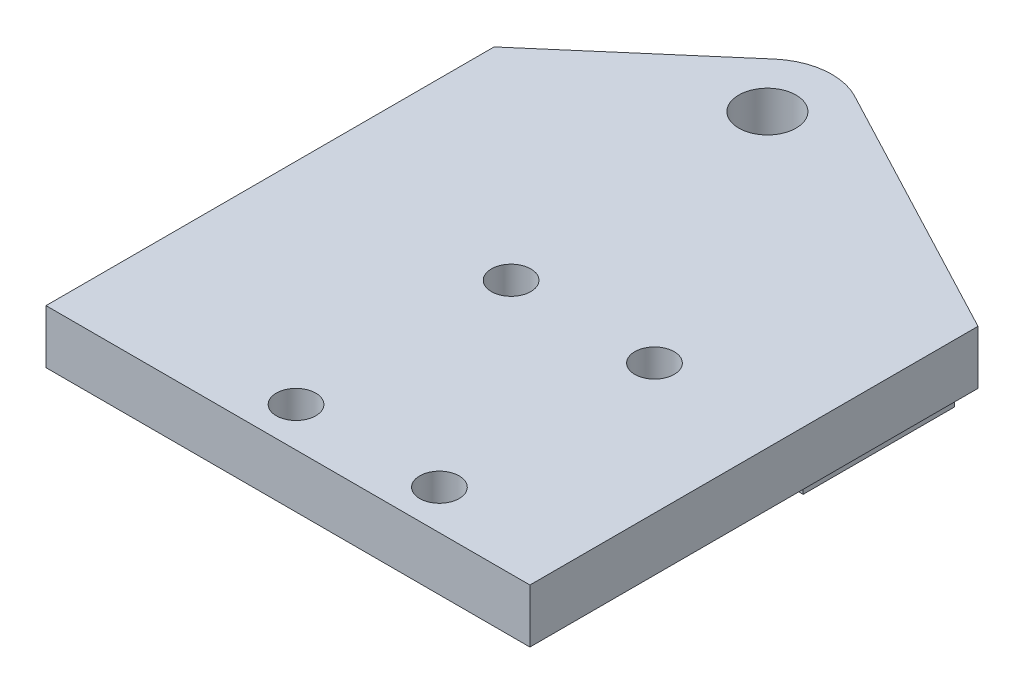
ISO-10303-21;
HEADER;
FILE_DESCRIPTION(('STEP AP214'),'2;1');
FILE_NAME('part.step','',(''),(''),'','','');
FILE_SCHEMA(('AUTOMOTIVE_DESIGN { 1 0 10303 214 1 1 1 1 }'));
ENDSEC;
DATA;
#1=APPLICATION_CONTEXT('core data for automotive mechanical design processes');
#2=APPLICATION_PROTOCOL_DEFINITION('international standard','automotive_design',2000,#1);
#3=PRODUCT_CONTEXT('',#1,'mechanical');
#4=PRODUCT('Part','Part','',(#3));
#5=PRODUCT_RELATED_PRODUCT_CATEGORY('part','',(#4));
#6=PRODUCT_DEFINITION_FORMATION('','',#4);
#7=PRODUCT_DEFINITION_CONTEXT('part definition',#1,'design');
#8=PRODUCT_DEFINITION('design','',#6,#7);
#9=PRODUCT_DEFINITION_SHAPE('','',#8);
#10=(LENGTH_UNIT() NAMED_UNIT(*) SI_UNIT(.MILLI.,.METRE.));
#11=(NAMED_UNIT(*) PLANE_ANGLE_UNIT() SI_UNIT($,.RADIAN.));
#12=(NAMED_UNIT(*) SI_UNIT($,.STERADIAN.) SOLID_ANGLE_UNIT());
#13=UNCERTAINTY_MEASURE_WITH_UNIT(LENGTH_MEASURE(1.E-05),#10,'distance_accuracy_value','');
#14=(GEOMETRIC_REPRESENTATION_CONTEXT(3) GLOBAL_UNCERTAINTY_ASSIGNED_CONTEXT((#13)) GLOBAL_UNIT_ASSIGNED_CONTEXT((#10,
#11,#12)) REPRESENTATION_CONTEXT('',''));
#15=CARTESIAN_POINT('',(0.,0.,0.));
#16=DIRECTION('',(0.,0.,1.));
#17=DIRECTION('',(1.,0.,0.));
#18=AXIS2_PLACEMENT_3D('',#15,#16,#17);
#19=CARTESIAN_POINT('',(6.25,0.,-29.5));
#20=DIRECTION('',(0.,1.,0.));
#21=DIRECTION('',(0.,0.,1.));
#22=AXIS2_PLACEMENT_3D('',#19,#20,#21);
#23=PLANE('',#22);
#24=CARTESIAN_POINT('',(7.25,0.,-2.20000000000001));
#25=DIRECTION('',(0.,1.,0.));
#26=DIRECTION('',(0.,0.,-1.));
#27=AXIS2_PLACEMENT_3D('',#24,#25,#26);
#28=CIRCLE('',#27,1.1);
#29=CARTESIAN_POINT('',(7.25,0.,-3.30000000000001));
#30=VERTEX_POINT('',#29);
#31=EDGE_CURVE('E137',#30,#30,#28,.T.);
#32=ORIENTED_EDGE('',*,*,#31,.T.);
#33=EDGE_LOOP('',(#32));
#34=FACE_BOUND('',#33,.T.);
#35=CARTESIAN_POINT('',(15.25,0.,-2.2));
#36=DIRECTION('',(0.,1.,0.));
#37=DIRECTION('',(0.,0.,1.));
#38=AXIS2_PLACEMENT_3D('',#35,#36,#37);
#39=CIRCLE('',#38,1.1);
#40=CARTESIAN_POINT('',(15.25,0.,-1.1));
#41=VERTEX_POINT('',#40);
#42=EDGE_CURVE('E146',#41,#41,#39,.T.);
#43=ORIENTED_EDGE('',*,*,#42,.T.);
#44=EDGE_LOOP('',(#43));
#45=FACE_BOUND('',#44,.T.);
#46=CARTESIAN_POINT('',(15.25,0.,-14.2));
#47=DIRECTION('',(0.,1.,0.));
#48=DIRECTION('',(0.,0.,-1.));
#49=AXIS2_PLACEMENT_3D('',#46,#47,#48);
#50=CIRCLE('',#49,1.1);
#51=CARTESIAN_POINT('',(15.25,0.,-15.3));
#52=VERTEX_POINT('',#51);
#53=EDGE_CURVE('E152',#52,#52,#50,.T.);
#54=ORIENTED_EDGE('',*,*,#53,.T.);
#55=EDGE_LOOP('',(#54));
#56=FACE_BOUND('',#55,.T.);
#57=CARTESIAN_POINT('',(7.25,0.,-14.2));
#58=DIRECTION('',(0.,1.,0.));
#59=DIRECTION('',(0.,0.,1.));
#60=AXIS2_PLACEMENT_3D('',#57,#58,#59);
#61=CIRCLE('',#60,1.1);
#62=CARTESIAN_POINT('',(7.25,0.,-13.1));
#63=VERTEX_POINT('',#62);
#64=EDGE_CURVE('E158',#63,#63,#61,.T.);
#65=ORIENTED_EDGE('',*,*,#64,.T.);
#66=EDGE_LOOP('',(#65));
#67=FACE_BOUND('',#66,.T.);
#68=DIRECTION('',(0.,0.,1.));
#69=VECTOR('',#68,1.);
#70=CARTESIAN_POINT('',(19.7440573676193,0.,-18.));
#71=LINE('',#70,#69);
#72=CARTESIAN_POINT('',(19.7440573676193,0.,-26.4534353213096));
#73=VERTEX_POINT('',#72);
#74=CARTESIAN_POINT('',(19.7440573676193,0.,-18.));
#75=VERTEX_POINT('',#74);
#76=EDGE_CURVE('E131',#73,#75,#71,.T.);
#77=ORIENTED_EDGE('',*,*,#76,.F.);
#78=DIRECTION('',(-0.884529116401271,0.,-0.466484986080352));
#79=VECTOR('',#78,1.);
#80=CARTESIAN_POINT('',(22.5,0.,-25.));
#81=LINE('',#80,#79);
#82=CARTESIAN_POINT('',(22.5,0.,-25.));
#83=VERTEX_POINT('',#82);
#84=EDGE_CURVE('E188',#83,#73,#81,.T.);
#85=ORIENTED_EDGE('',*,*,#84,.F.);
#86=DIRECTION('',(0.,0.,-1.));
#87=VECTOR('',#86,1.);
#88=CARTESIAN_POINT('',(22.5,0.,0.));
#89=LINE('',#88,#87);
#90=CARTESIAN_POINT('',(22.5,0.,0.));
#91=VERTEX_POINT('',#90);
#92=EDGE_CURVE('E186',#91,#83,#89,.T.);
#93=ORIENTED_EDGE('',*,*,#92,.F.);
#94=DIRECTION('',(1.,0.,0.));
#95=VECTOR('',#94,1.);
#96=CARTESIAN_POINT('',(-4.5,0.,0.));
#97=LINE('',#96,#95);
#98=CARTESIAN_POINT('',(-4.5,0.,0.));
#99=VERTEX_POINT('',#98);
#100=EDGE_CURVE('E184',#99,#91,#97,.T.);
#101=ORIENTED_EDGE('',*,*,#100,.F.);
#102=DIRECTION('',(0.,0.,1.));
#103=VECTOR('',#102,1.);
#104=CARTESIAN_POINT('',(-4.5,0.,0.));
#105=LINE('',#104,#103);
#106=CARTESIAN_POINT('',(-4.5,0.,-25.));
#107=VERTEX_POINT('',#106);
#108=EDGE_CURVE('E164',#107,#99,#105,.T.);
#109=ORIENTED_EDGE('',*,*,#108,.F.);
#110=DIRECTION('',(-0.758043335511819,0.,0.652204186958437));
#111=VECTOR('',#110,1.);
#112=CARTESIAN_POINT('',(-4.5,0.,-25.));
#113=LINE('',#112,#111);
#114=CARTESIAN_POINT('',(1.74405736761932,0.,-30.3722527037592));
#115=VERTEX_POINT('',#114);
#116=EDGE_CURVE('E171',#115,#107,#113,.T.);
#117=ORIENTED_EDGE('',*,*,#116,.F.);
#118=DIRECTION('',(0.,0.,-1.));
#119=VECTOR('',#118,1.);
#120=CARTESIAN_POINT('',(1.74405736761932,0.,-30.3722527037592));
#121=LINE('',#120,#119);
#122=CARTESIAN_POINT('',(1.74405736761932,0.,-18.));
#123=VERTEX_POINT('',#122);
#124=EDGE_CURVE('E55',#123,#115,#121,.T.);
#125=ORIENTED_EDGE('',*,*,#124,.F.);
#126=DIRECTION('',(-1.,0.,0.));
#127=VECTOR('',#126,1.);
#128=CARTESIAN_POINT('',(1.74405736761932,0.,-18.));
#129=LINE('',#128,#127);
#130=EDGE_CURVE('E50',#75,#123,#129,.T.);
#131=ORIENTED_EDGE('',*,*,#130,.F.);
#132=EDGE_LOOP('',(#77,#85,#93,#101,#109,#117,#125,#131));
#133=FACE_BOUND('',#132,.T.);
#134=ADVANCED_FACE('F35',(#34,#45,#56,#67,#133),#23,.F.);
#135=CARTESIAN_POINT('',(6.25,3.,-29.5));
#136=DIRECTION('',(0.,1.,0.));
#137=DIRECTION('',(0.,0.,1.));
#138=AXIS2_PLACEMENT_3D('',#135,#136,#137);
#139=PLANE('',#138);
#140=CARTESIAN_POINT('',(7.25,3.,-2.20000000000001));
#141=DIRECTION('',(0.,1.,0.));
#142=DIRECTION('',(0.,0.,-1.));
#143=AXIS2_PLACEMENT_3D('',#140,#141,#142);
#144=CIRCLE('',#143,1.1);
#145=CARTESIAN_POINT('',(7.25,3.,-3.30000000000001));
#146=VERTEX_POINT('',#145);
#147=EDGE_CURVE('E143',#146,#146,#144,.T.);
#148=ORIENTED_EDGE('',*,*,#147,.F.);
#149=EDGE_LOOP('',(#148));
#150=FACE_BOUND('',#149,.T.);
#151=CARTESIAN_POINT('',(15.25,3.,-14.2));
#152=DIRECTION('',(0.,1.,0.));
#153=DIRECTION('',(0.,0.,-1.));
#154=AXIS2_PLACEMENT_3D('',#151,#152,#153);
#155=CIRCLE('',#154,1.1);
#156=CARTESIAN_POINT('',(15.25,3.,-15.3));
#157=VERTEX_POINT('',#156);
#158=EDGE_CURVE('E155',#157,#157,#155,.T.);
#159=ORIENTED_EDGE('',*,*,#158,.F.);
#160=EDGE_LOOP('',(#159));
#161=FACE_BOUND('',#160,.T.);
#162=DIRECTION('',(0.,0.,1.));
#163=VECTOR('',#162,1.);
#164=CARTESIAN_POINT('',(-4.5,3.,0.));
#165=LINE('',#164,#163);
#166=CARTESIAN_POINT('',(-4.5,3.,-25.));
#167=VERTEX_POINT('',#166);
#168=CARTESIAN_POINT('',(-4.5,3.,0.));
#169=VERTEX_POINT('',#168);
#170=EDGE_CURVE('E167',#167,#169,#165,.T.);
#171=ORIENTED_EDGE('',*,*,#170,.T.);
#172=DIRECTION('',(1.,0.,0.));
#173=VECTOR('',#172,1.);
#174=CARTESIAN_POINT('',(-4.5,3.,0.));
#175=LINE('',#174,#173);
#176=CARTESIAN_POINT('',(22.5,3.,0.));
#177=VERTEX_POINT('',#176);
#178=EDGE_CURVE('E170',#169,#177,#175,.T.);
#179=ORIENTED_EDGE('',*,*,#178,.T.);
#180=DIRECTION('',(0.,0.,-1.));
#181=VECTOR('',#180,1.);
#182=CARTESIAN_POINT('',(22.5,3.,0.));
#183=LINE('',#182,#181);
#184=CARTESIAN_POINT('',(22.5,3.,-25.));
#185=VERTEX_POINT('',#184);
#186=EDGE_CURVE('E173',#177,#185,#183,.T.);
#187=ORIENTED_EDGE('',*,*,#186,.T.);
#188=DIRECTION('',(-0.884529116401271,0.,-0.466484986080352));
#189=VECTOR('',#188,1.);
#190=CARTESIAN_POINT('',(22.5,3.,-25.));
#191=LINE('',#190,#189);
#192=CARTESIAN_POINT('',(7.92934594988926,3.,-32.6843048190446));
#193=VERTEX_POINT('',#192);
#194=EDGE_CURVE('E175',#185,#193,#191,.T.);
#195=ORIENTED_EDGE('',*,*,#194,.T.);
#196=CARTESIAN_POINT('',(6.25,3.,-29.5));
#197=DIRECTION('',(0.,1.,0.));
#198=DIRECTION('',(0.,0.,1.));
#199=AXIS2_PLACEMENT_3D('',#196,#197,#198);
#200=CIRCLE('',#199,3.6);
#201=CARTESIAN_POINT('',(3.90206492694963,3.,-32.2289560078426));
#202=VERTEX_POINT('',#201);
#203=EDGE_CURVE('E177',#193,#202,#200,.T.);
#204=ORIENTED_EDGE('',*,*,#203,.T.);
#205=DIRECTION('',(-0.758043335511819,0.,0.652204186958437));
#206=VECTOR('',#205,1.);
#207=CARTESIAN_POINT('',(-4.5,3.,-25.));
#208=LINE('',#207,#206);
#209=EDGE_CURVE('E179',#202,#167,#208,.T.);
#210=ORIENTED_EDGE('',*,*,#209,.T.);
#211=EDGE_LOOP('',(#171,#179,#187,#195,#204,#210));
#212=FACE_BOUND('',#211,.T.);
#213=CARTESIAN_POINT('',(7.25,3.,-14.2));
#214=DIRECTION('',(0.,1.,0.));
#215=DIRECTION('',(0.,0.,1.));
#216=AXIS2_PLACEMENT_3D('',#213,#214,#215);
#217=CIRCLE('',#216,1.1);
#218=CARTESIAN_POINT('',(7.25,3.,-13.1));
#219=VERTEX_POINT('',#218);
#220=EDGE_CURVE('E161',#219,#219,#217,.T.);
#221=ORIENTED_EDGE('',*,*,#220,.F.);
#222=EDGE_LOOP('',(#221));
#223=FACE_BOUND('',#222,.T.);
#224=CARTESIAN_POINT('',(15.25,3.,-2.2));
#225=DIRECTION('',(0.,1.,0.));
#226=DIRECTION('',(0.,0.,1.));
#227=AXIS2_PLACEMENT_3D('',#224,#225,#226);
#228=CIRCLE('',#227,1.1);
#229=CARTESIAN_POINT('',(15.25,3.,-1.1));
#230=VERTEX_POINT('',#229);
#231=EDGE_CURVE('E149',#230,#230,#228,.T.);
#232=ORIENTED_EDGE('',*,*,#231,.F.);
#233=EDGE_LOOP('',(#232));
#234=FACE_BOUND('',#233,.T.);
#235=CARTESIAN_POINT('',(6.25,3.,-29.5));
#236=DIRECTION('',(0.,1.,0.));
#237=DIRECTION('',(0.,0.,1.));
#238=AXIS2_PLACEMENT_3D('',#235,#236,#237);
#239=CIRCLE('',#238,1.6);
#240=CARTESIAN_POINT('',(6.25,3.,-27.9));
#241=VERTEX_POINT('',#240);
#242=EDGE_CURVE('E134',#241,#241,#239,.T.);
#243=ORIENTED_EDGE('',*,*,#242,.F.);
#244=EDGE_LOOP('',(#243));
#245=FACE_BOUND('',#244,.T.);
#246=ADVANCED_FACE('F248',(#150,#161,#212,#223,#234,#245),#139,.T.);
#247=CARTESIAN_POINT('',(-4.5,3.,0.));
#248=DIRECTION('',(1.,0.,0.));
#249=DIRECTION('',(0.,0.,-1.));
#250=AXIS2_PLACEMENT_3D('',#247,#248,#249);
#251=PLANE('',#250);
#252=ORIENTED_EDGE('',*,*,#108,.T.);
#253=DIRECTION('',(0.,-1.,0.));
#254=VECTOR('',#253,1.);
#255=CARTESIAN_POINT('',(-4.5,3.,0.));
#256=LINE('',#255,#254);
#257=EDGE_CURVE('E11',#169,#99,#256,.T.);
#258=ORIENTED_EDGE('',*,*,#257,.F.);
#259=ORIENTED_EDGE('',*,*,#170,.F.);
#260=DIRECTION('',(0.,-1.,0.));
#261=VECTOR('',#260,1.);
#262=CARTESIAN_POINT('',(-4.5,3.,-25.));
#263=LINE('',#262,#261);
#264=EDGE_CURVE('E181',#167,#107,#263,.T.);
#265=ORIENTED_EDGE('',*,*,#264,.T.);
#266=EDGE_LOOP('',(#252,#258,#259,#265));
#267=FACE_BOUND('',#266,.T.);
#268=ADVANCED_FACE('F37',(#267),#251,.F.);
#269=CARTESIAN_POINT('',(-4.5,3.,0.));
#270=DIRECTION('',(0.,0.,-1.));
#271=DIRECTION('',(-1.,0.,0.));
#272=AXIS2_PLACEMENT_3D('',#269,#270,#271);
#273=PLANE('',#272);
#274=ORIENTED_EDGE('',*,*,#100,.T.);
#275=DIRECTION('',(0.,-1.,0.));
#276=VECTOR('',#275,1.);
#277=CARTESIAN_POINT('',(22.5,3.,0.));
#278=LINE('',#277,#276);
#279=EDGE_CURVE('E43',#177,#91,#278,.T.);
#280=ORIENTED_EDGE('',*,*,#279,.F.);
#281=ORIENTED_EDGE('',*,*,#178,.F.);
#282=ORIENTED_EDGE('',*,*,#257,.T.);
#283=EDGE_LOOP('',(#274,#280,#281,#282));
#284=FACE_BOUND('',#283,.T.);
#285=ADVANCED_FACE('F271',(#284),#273,.F.);
#286=CARTESIAN_POINT('',(22.5,3.,0.));
#287=DIRECTION('',(-1.,0.,0.));
#288=DIRECTION('',(0.,0.,1.));
#289=AXIS2_PLACEMENT_3D('',#286,#287,#288);
#290=PLANE('',#289);
#291=ORIENTED_EDGE('',*,*,#92,.T.);
#292=DIRECTION('',(0.,-1.,0.));
#293=VECTOR('',#292,1.);
#294=CARTESIAN_POINT('',(22.5,3.,-25.));
#295=LINE('',#294,#293);
#296=EDGE_CURVE('E198',#185,#83,#295,.T.);
#297=ORIENTED_EDGE('',*,*,#296,.F.);
#298=ORIENTED_EDGE('',*,*,#186,.F.);
#299=ORIENTED_EDGE('',*,*,#279,.T.);
#300=EDGE_LOOP('',(#291,#297,#298,#299));
#301=FACE_BOUND('',#300,.T.);
#302=ADVANCED_FACE('F205',(#301),#290,.F.);
#303=CARTESIAN_POINT('',(22.5,3.,-25.));
#304=DIRECTION('',(-0.466484986080352,0.,0.884529116401271));
#305=DIRECTION('',(0.884529116401272,0.,0.466484986080352));
#306=AXIS2_PLACEMENT_3D('',#303,#304,#305);
#307=PLANE('',#306);
#308=ORIENTED_EDGE('',*,*,#84,.T.);
#309=DIRECTION('',(0.,1.,0.));
#310=VECTOR('',#309,1.);
#311=CARTESIAN_POINT('',(19.7440573676193,-3.,-26.4534353213096));
#312=LINE('',#311,#310);
#313=CARTESIAN_POINT('',(19.7440573676193,-3.,-26.4534353213096));
#314=VERTEX_POINT('',#313);
#315=EDGE_CURVE('E139',#314,#73,#312,.T.);
#316=ORIENTED_EDGE('',*,*,#315,.F.);
#317=DIRECTION('',(0.884529116401271,0.,0.466484986080352));
#318=VECTOR('',#317,1.);
#319=CARTESIAN_POINT('',(19.7440573676193,-3.,-26.4534353213096));
#320=LINE('',#319,#318);
#321=CARTESIAN_POINT('',(7.92934594988926,-3.,-32.6843048190446));
#322=VERTEX_POINT('',#321);
#323=EDGE_CURVE('E226',#322,#314,#320,.T.);
#324=ORIENTED_EDGE('',*,*,#323,.F.);
#325=DIRECTION('',(0.,-1.,0.));
#326=VECTOR('',#325,1.);
#327=CARTESIAN_POINT('',(7.92934594988926,3.,-32.6843048190446));
#328=LINE('',#327,#326);
#329=EDGE_CURVE('E196',#193,#322,#328,.T.);
#330=ORIENTED_EDGE('',*,*,#329,.F.);
#331=ORIENTED_EDGE('',*,*,#194,.F.);
#332=ORIENTED_EDGE('',*,*,#296,.T.);
#333=EDGE_LOOP('',(#308,#316,#324,#330,#331,#332));
#334=FACE_BOUND('',#333,.T.);
#335=ADVANCED_FACE('F213',(#334),#307,.F.);
#336=CARTESIAN_POINT('',(6.25,3.,-29.5));
#337=DIRECTION('',(0.,-1.,0.));
#338=DIRECTION('',(0.,0.,-1.));
#339=AXIS2_PLACEMENT_3D('',#336,#337,#338);
#340=CYLINDRICAL_SURFACE('',#339,3.6);
#341=ORIENTED_EDGE('',*,*,#329,.T.);
#342=CARTESIAN_POINT('',(6.25,-3.,-29.5));
#343=DIRECTION('',(0.,-1.,0.));
#344=DIRECTION('',(0.,0.,-1.));
#345=AXIS2_PLACEMENT_3D('',#342,#343,#344);
#346=CIRCLE('',#345,3.6);
#347=CARTESIAN_POINT('',(3.90206492694963,-3.,-32.2289560078426));
#348=VERTEX_POINT('',#347);
#349=EDGE_CURVE('E228',#348,#322,#346,.T.);
#350=ORIENTED_EDGE('',*,*,#349,.F.);
#351=DIRECTION('',(0.,-1.,0.));
#352=VECTOR('',#351,1.);
#353=CARTESIAN_POINT('',(3.90206492694963,3.,-32.2289560078426));
#354=LINE('',#353,#352);
#355=EDGE_CURVE('E194',#202,#348,#354,.T.);
#356=ORIENTED_EDGE('',*,*,#355,.F.);
#357=ORIENTED_EDGE('',*,*,#203,.F.);
#358=EDGE_LOOP('',(#341,#350,#356,#357));
#359=FACE_BOUND('',#358,.T.);
#360=ADVANCED_FACE('F263',(#359),#340,.T.);
#361=CARTESIAN_POINT('',(-4.5,3.,-25.));
#362=DIRECTION('',(0.652204186958437,0.,0.758043335511819));
#363=DIRECTION('',(0.758043335511819,0.,-0.652204186958437));
#364=AXIS2_PLACEMENT_3D('',#361,#362,#363);
#365=PLANE('',#364);
#366=ORIENTED_EDGE('',*,*,#355,.T.);
#367=DIRECTION('',(0.758043335511819,0.,-0.652204186958437));
#368=VECTOR('',#367,1.);
#369=CARTESIAN_POINT('',(3.90206492694963,-3.,-32.2289560078426));
#370=LINE('',#369,#368);
#371=CARTESIAN_POINT('',(1.74405736761932,-3.,-30.3722527037592));
#372=VERTEX_POINT('',#371);
#373=EDGE_CURVE('E120',#372,#348,#370,.T.);
#374=ORIENTED_EDGE('',*,*,#373,.F.);
#375=DIRECTION('',(0.,1.,0.));
#376=VECTOR('',#375,1.);
#377=CARTESIAN_POINT('',(1.74405736761932,-3.,-30.3722527037592));
#378=LINE('',#377,#376);
#379=EDGE_CURVE('E116',#372,#115,#378,.T.);
#380=ORIENTED_EDGE('',*,*,#379,.T.);
#381=ORIENTED_EDGE('',*,*,#116,.T.);
#382=ORIENTED_EDGE('',*,*,#264,.F.);
#383=ORIENTED_EDGE('',*,*,#209,.F.);
#384=EDGE_LOOP('',(#366,#374,#380,#381,#382,#383));
#385=FACE_BOUND('',#384,.T.);
#386=ADVANCED_FACE('F259',(#385),#365,.F.);
#387=CARTESIAN_POINT('',(7.25,3.,-14.2));
#388=DIRECTION('',(0.,-1.,0.));
#389=DIRECTION('',(0.,0.,-1.));
#390=AXIS2_PLACEMENT_3D('',#387,#388,#389);
#391=CYLINDRICAL_SURFACE('',#390,1.1);
#392=ORIENTED_EDGE('',*,*,#220,.T.);
#393=EDGE_LOOP('',(#392));
#394=FACE_BOUND('',#393,.T.);
#395=ORIENTED_EDGE('',*,*,#64,.F.);
#396=EDGE_LOOP('',(#395));
#397=FACE_BOUND('',#396,.T.);
#398=ADVANCED_FACE('F262',(#394,#397),#391,.F.);
#399=CARTESIAN_POINT('',(15.25,3.,-14.2));
#400=DIRECTION('',(0.,-1.,0.));
#401=DIRECTION('',(0.,0.,-1.));
#402=AXIS2_PLACEMENT_3D('',#399,#400,#401);
#403=CYLINDRICAL_SURFACE('',#402,1.1);
#404=ORIENTED_EDGE('',*,*,#158,.T.);
#405=EDGE_LOOP('',(#404));
#406=FACE_BOUND('',#405,.T.);
#407=ORIENTED_EDGE('',*,*,#53,.F.);
#408=EDGE_LOOP('',(#407));
#409=FACE_BOUND('',#408,.T.);
#410=ADVANCED_FACE('F296',(#406,#409),#403,.F.);
#411=CARTESIAN_POINT('',(15.25,3.,-2.2));
#412=DIRECTION('',(0.,-1.,0.));
#413=DIRECTION('',(0.,0.,-1.));
#414=AXIS2_PLACEMENT_3D('',#411,#412,#413);
#415=CYLINDRICAL_SURFACE('',#414,1.1);
#416=ORIENTED_EDGE('',*,*,#231,.T.);
#417=EDGE_LOOP('',(#416));
#418=FACE_BOUND('',#417,.T.);
#419=ORIENTED_EDGE('',*,*,#42,.F.);
#420=EDGE_LOOP('',(#419));
#421=FACE_BOUND('',#420,.T.);
#422=ADVANCED_FACE('F293',(#418,#421),#415,.F.);
#423=CARTESIAN_POINT('',(7.25,3.,-2.20000000000001));
#424=DIRECTION('',(0.,-1.,0.));
#425=DIRECTION('',(0.,0.,-1.));
#426=AXIS2_PLACEMENT_3D('',#423,#424,#425);
#427=CYLINDRICAL_SURFACE('',#426,1.1);
#428=ORIENTED_EDGE('',*,*,#147,.T.);
#429=EDGE_LOOP('',(#428));
#430=FACE_BOUND('',#429,.T.);
#431=ORIENTED_EDGE('',*,*,#31,.F.);
#432=EDGE_LOOP('',(#431));
#433=FACE_BOUND('',#432,.T.);
#434=ADVANCED_FACE('F243',(#430,#433),#427,.F.);
#435=CARTESIAN_POINT('',(6.25,3.,-29.5));
#436=DIRECTION('',(0.,-1.,0.));
#437=DIRECTION('',(0.,0.,-1.));
#438=AXIS2_PLACEMENT_3D('',#435,#436,#437);
#439=CYLINDRICAL_SURFACE('',#438,1.6);
#440=ORIENTED_EDGE('',*,*,#242,.T.);
#441=EDGE_LOOP('',(#440));
#442=FACE_BOUND('',#441,.T.);
#443=CARTESIAN_POINT('',(6.25,-3.,-29.5));
#444=DIRECTION('',(0.,-1.,0.));
#445=DIRECTION('',(0.,0.,-1.));
#446=AXIS2_PLACEMENT_3D('',#443,#444,#445);
#447=CIRCLE('',#446,1.6);
#448=CARTESIAN_POINT('',(6.25,-3.,-31.1));
#449=VERTEX_POINT('',#448);
#450=EDGE_CURVE('E224',#449,#449,#447,.T.);
#451=ORIENTED_EDGE('',*,*,#450,.T.);
#452=EDGE_LOOP('',(#451));
#453=FACE_BOUND('',#452,.T.);
#454=ADVANCED_FACE('F235',(#442,#453),#439,.F.);
#455=CARTESIAN_POINT('',(6.25,-3.,-29.5));
#456=DIRECTION('',(0.,-1.,0.));
#457=DIRECTION('',(0.,0.,-1.));
#458=AXIS2_PLACEMENT_3D('',#455,#456,#457);
#459=PLANE('',#458);
#460=DIRECTION('',(-1.,0.,0.));
#461=VECTOR('',#460,1.);
#462=CARTESIAN_POINT('',(1.74405736761932,-3.,-18.));
#463=LINE('',#462,#461);
#464=CARTESIAN_POINT('',(19.7440573676193,-3.,-18.));
#465=VERTEX_POINT('',#464);
#466=CARTESIAN_POINT('',(1.74405736761932,-3.,-18.));
#467=VERTEX_POINT('',#466);
#468=EDGE_CURVE('E121',#465,#467,#463,.T.);
#469=ORIENTED_EDGE('',*,*,#468,.T.);
#470=DIRECTION('',(0.,0.,-1.));
#471=VECTOR('',#470,1.);
#472=CARTESIAN_POINT('',(1.74405736761932,-3.,-30.3722527037592));
#473=LINE('',#472,#471);
#474=EDGE_CURVE('E110',#467,#372,#473,.T.);
#475=ORIENTED_EDGE('',*,*,#474,.T.);
#476=ORIENTED_EDGE('',*,*,#373,.T.);
#477=ORIENTED_EDGE('',*,*,#349,.T.);
#478=ORIENTED_EDGE('',*,*,#323,.T.);
#479=DIRECTION('',(0.,0.,1.));
#480=VECTOR('',#479,1.);
#481=CARTESIAN_POINT('',(19.7440573676193,-3.,-18.));
#482=LINE('',#481,#480);
#483=EDGE_CURVE('E127',#314,#465,#482,.T.);
#484=ORIENTED_EDGE('',*,*,#483,.T.);
#485=EDGE_LOOP('',(#469,#475,#476,#477,#478,#484));
#486=FACE_BOUND('',#485,.T.);
#487=ORIENTED_EDGE('',*,*,#450,.F.);
#488=EDGE_LOOP('',(#487));
#489=FACE_BOUND('',#488,.T.);
#490=ADVANCED_FACE('F124',(#486,#489),#459,.T.);
#491=CARTESIAN_POINT('',(1.74405736761932,-3.,-18.));
#492=DIRECTION('',(0.,0.,-1.));
#493=DIRECTION('',(-1.,0.,0.));
#494=AXIS2_PLACEMENT_3D('',#491,#492,#493);
#495=PLANE('',#494);
#496=ORIENTED_EDGE('',*,*,#130,.T.);
#497=DIRECTION('',(0.,1.,0.));
#498=VECTOR('',#497,1.);
#499=CARTESIAN_POINT('',(1.74405736761932,-3.,-18.));
#500=LINE('',#499,#498);
#501=EDGE_CURVE('E114',#467,#123,#500,.T.);
#502=ORIENTED_EDGE('',*,*,#501,.F.);
#503=ORIENTED_EDGE('',*,*,#468,.F.);
#504=DIRECTION('',(0.,1.,0.));
#505=VECTOR('',#504,1.);
#506=CARTESIAN_POINT('',(19.7440573676193,-3.,-18.));
#507=LINE('',#506,#505);
#508=EDGE_CURVE('E218',#465,#75,#507,.T.);
#509=ORIENTED_EDGE('',*,*,#508,.T.);
#510=EDGE_LOOP('',(#496,#502,#503,#509));
#511=FACE_BOUND('',#510,.T.);
#512=ADVANCED_FACE('F133',(#511),#495,.F.);
#513=CARTESIAN_POINT('',(1.74405736761932,-3.,-30.3722527037592));
#514=DIRECTION('',(1.,0.,0.));
#515=DIRECTION('',(0.,0.,-1.));
#516=AXIS2_PLACEMENT_3D('',#513,#514,#515);
#517=PLANE('',#516);
#518=ORIENTED_EDGE('',*,*,#124,.T.);
#519=ORIENTED_EDGE('',*,*,#379,.F.);
#520=ORIENTED_EDGE('',*,*,#474,.F.);
#521=ORIENTED_EDGE('',*,*,#501,.T.);
#522=EDGE_LOOP('',(#518,#519,#520,#521));
#523=FACE_BOUND('',#522,.T.);
#524=ADVANCED_FACE('F112',(#523),#517,.F.);
#525=CARTESIAN_POINT('',(19.7440573676193,-3.,-18.));
#526=DIRECTION('',(-1.,0.,0.));
#527=DIRECTION('',(0.,0.,1.));
#528=AXIS2_PLACEMENT_3D('',#525,#526,#527);
#529=PLANE('',#528);
#530=ORIENTED_EDGE('',*,*,#76,.T.);
#531=ORIENTED_EDGE('',*,*,#508,.F.);
#532=ORIENTED_EDGE('',*,*,#483,.F.);
#533=ORIENTED_EDGE('',*,*,#315,.T.);
#534=EDGE_LOOP('',(#530,#531,#532,#533));
#535=FACE_BOUND('',#534,.T.);
#536=ADVANCED_FACE('F217',(#535),#529,.F.);
#537=CLOSED_SHELL('',(#134,#246,#268,#285,#302,#335,#360,#386,#398,#410,#422,#434,#454,#490,
#512,#524,#536));
#538=MANIFOLD_SOLID_BREP('B2',#537);
#539=ADVANCED_BREP_SHAPE_REPRESENTATION('',(#18,#538),#14);
#540=SHAPE_DEFINITION_REPRESENTATION(#9,#539);
ENDSEC;
END-ISO-10303-21;
